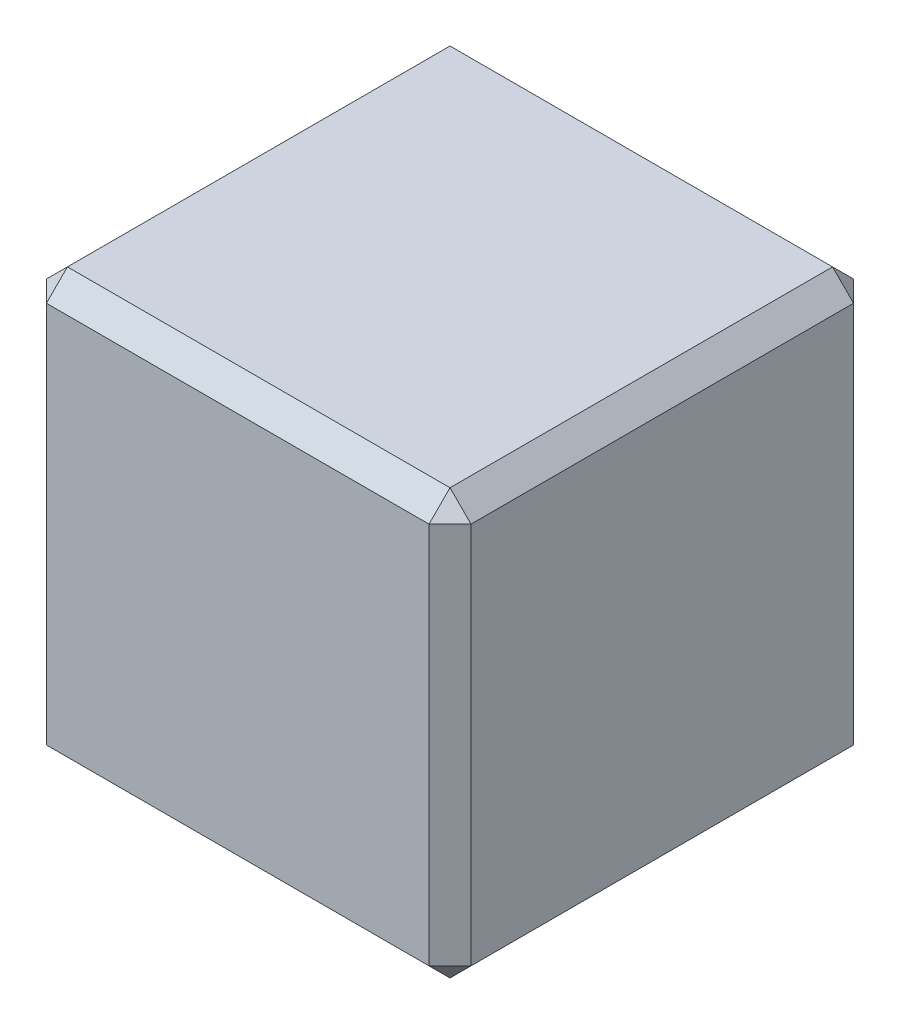
ISO-10303-21;
HEADER;
FILE_DESCRIPTION(('STEP AP214'),'2;1');
FILE_NAME('part.step','',(''),(''),'','','');
FILE_SCHEMA(('AUTOMOTIVE_DESIGN { 1 0 10303 214 1 1 1 1 }'));
ENDSEC;
DATA;
#1=APPLICATION_CONTEXT('core data for automotive mechanical design processes');
#2=APPLICATION_PROTOCOL_DEFINITION('international standard','automotive_design',2000,#1);
#3=PRODUCT_CONTEXT('',#1,'mechanical');
#4=PRODUCT('Part','Part','',(#3));
#5=PRODUCT_RELATED_PRODUCT_CATEGORY('part','',(#4));
#6=PRODUCT_DEFINITION_FORMATION('','',#4);
#7=PRODUCT_DEFINITION_CONTEXT('part definition',#1,'design');
#8=PRODUCT_DEFINITION('design','',#6,#7);
#9=PRODUCT_DEFINITION_SHAPE('','',#8);
#10=(LENGTH_UNIT() NAMED_UNIT(*) SI_UNIT(.MILLI.,.METRE.));
#11=(NAMED_UNIT(*) PLANE_ANGLE_UNIT() SI_UNIT($,.RADIAN.));
#12=(NAMED_UNIT(*) SI_UNIT($,.STERADIAN.) SOLID_ANGLE_UNIT());
#13=UNCERTAINTY_MEASURE_WITH_UNIT(LENGTH_MEASURE(1.E-05),#10,'distance_accuracy_value','');
#14=(GEOMETRIC_REPRESENTATION_CONTEXT(3) GLOBAL_UNCERTAINTY_ASSIGNED_CONTEXT((#13)) GLOBAL_UNIT_ASSIGNED_CONTEXT((#10,
#11,#12)) REPRESENTATION_CONTEXT('',''));
#15=CARTESIAN_POINT('',(0.,0.,0.));
#16=DIRECTION('',(0.,0.,1.));
#17=DIRECTION('',(1.,0.,0.));
#18=AXIS2_PLACEMENT_3D('',#15,#16,#17);
#19=CARTESIAN_POINT('',(50.54,101.08,-50.54));
#20=DIRECTION('',(-1.,0.,0.));
#21=DIRECTION('',(0.,0.,1.));
#22=AXIS2_PLACEMENT_3D('',#19,#20,#21);
#23=PLANE('',#22);
#24=DIRECTION('',(0.,0.,-1.));
#25=VECTOR('',#24,1.);
#26=CARTESIAN_POINT('',(50.54,5.00000000000002,-50.54));
#27=LINE('',#26,#25);
#28=CARTESIAN_POINT('',(50.54,5.00000000000002,45.54));
#29=VERTEX_POINT('',#28);
#30=CARTESIAN_POINT('',(50.54,5.00000000000002,-45.54));
#31=VERTEX_POINT('',#30);
#32=EDGE_CURVE('E286',#29,#31,#27,.T.);
#33=ORIENTED_EDGE('',*,*,#32,.T.);
#34=DIRECTION('',(0.,1.,0.));
#35=VECTOR('',#34,1.);
#36=CARTESIAN_POINT('',(50.54,101.08,-45.54));
#37=LINE('',#36,#35);
#38=CARTESIAN_POINT('',(50.54,96.08,-45.54));
#39=VERTEX_POINT('',#38);
#40=EDGE_CURVE('E218',#31,#39,#37,.T.);
#41=ORIENTED_EDGE('',*,*,#40,.T.);
#42=DIRECTION('',(0.,0.,1.));
#43=VECTOR('',#42,1.);
#44=CARTESIAN_POINT('',(50.54,96.08,50.54));
#45=LINE('',#44,#43);
#46=CARTESIAN_POINT('',(50.54,96.08,45.54));
#47=VERTEX_POINT('',#46);
#48=EDGE_CURVE('E279',#39,#47,#45,.T.);
#49=ORIENTED_EDGE('',*,*,#48,.T.);
#50=DIRECTION('',(0.,-1.,0.));
#51=VECTOR('',#50,1.);
#52=CARTESIAN_POINT('',(50.54,101.08,45.54));
#53=LINE('',#52,#51);
#54=EDGE_CURVE('E281',#47,#29,#53,.T.);
#55=ORIENTED_EDGE('',*,*,#54,.T.);
#56=EDGE_LOOP('',(#33,#41,#49,#55));
#57=FACE_BOUND('',#56,.T.);
#58=ADVANCED_FACE('F39',(#57),#23,.F.);
#59=CARTESIAN_POINT('',(-50.54,101.08,-50.54));
#60=DIRECTION('',(0.,0.,1.));
#61=DIRECTION('',(1.,0.,0.));
#62=AXIS2_PLACEMENT_3D('',#59,#60,#61);
#63=PLANE('',#62);
#64=DIRECTION('',(0.,-1.,0.));
#65=VECTOR('',#64,1.);
#66=CARTESIAN_POINT('',(45.54,101.08,-50.54));
#67=LINE('',#66,#65);
#68=CARTESIAN_POINT('',(45.54,96.08,-50.54));
#69=VERTEX_POINT('',#68);
#70=CARTESIAN_POINT('',(45.54,4.99999999999998,-50.54));
#71=VERTEX_POINT('',#70);
#72=EDGE_CURVE('E137',#69,#71,#67,.T.);
#73=ORIENTED_EDGE('',*,*,#72,.T.);
#74=DIRECTION('',(-1.,0.,0.));
#75=VECTOR('',#74,1.);
#76=CARTESIAN_POINT('',(-50.54,4.99999999999998,-50.54));
#77=LINE('',#76,#75);
#78=CARTESIAN_POINT('',(-45.54,4.99999999999998,-50.54));
#79=VERTEX_POINT('',#78);
#80=EDGE_CURVE('E133',#71,#79,#77,.T.);
#81=ORIENTED_EDGE('',*,*,#80,.T.);
#82=DIRECTION('',(0.,1.,0.));
#83=VECTOR('',#82,1.);
#84=CARTESIAN_POINT('',(-45.54,101.08,-50.54));
#85=LINE('',#84,#83);
#86=CARTESIAN_POINT('',(-45.54,96.08,-50.54));
#87=VERTEX_POINT('',#86);
#88=EDGE_CURVE('E127',#79,#87,#85,.T.);
#89=ORIENTED_EDGE('',*,*,#88,.T.);
#90=DIRECTION('',(1.,0.,0.));
#91=VECTOR('',#90,1.);
#92=CARTESIAN_POINT('',(50.54,96.08,-50.54));
#93=LINE('',#92,#91);
#94=EDGE_CURVE('E130',#87,#69,#93,.T.);
#95=ORIENTED_EDGE('',*,*,#94,.T.);
#96=EDGE_LOOP('',(#73,#81,#89,#95));
#97=FACE_BOUND('',#96,.T.);
#98=ADVANCED_FACE('F129',(#97),#63,.F.);
#99=CARTESIAN_POINT('',(-50.54,101.08,-50.54));
#100=DIRECTION('',(1.,0.,0.));
#101=DIRECTION('',(0.,0.,-1.));
#102=AXIS2_PLACEMENT_3D('',#99,#100,#101);
#103=PLANE('',#102);
#104=DIRECTION('',(0.,0.,-1.));
#105=VECTOR('',#104,1.);
#106=CARTESIAN_POINT('',(-50.54,96.08,-50.54));
#107=LINE('',#106,#105);
#108=CARTESIAN_POINT('',(-50.54,96.08,45.54));
#109=VERTEX_POINT('',#108);
#110=CARTESIAN_POINT('',(-50.54,96.08,-45.54));
#111=VERTEX_POINT('',#110);
#112=EDGE_CURVE('E228',#109,#111,#107,.T.);
#113=ORIENTED_EDGE('',*,*,#112,.T.);
#114=DIRECTION('',(0.,-1.,0.));
#115=VECTOR('',#114,1.);
#116=CARTESIAN_POINT('',(-50.54,101.08,-45.54));
#117=LINE('',#116,#115);
#118=CARTESIAN_POINT('',(-50.54,4.99999999999998,-45.54));
#119=VERTEX_POINT('',#118);
#120=EDGE_CURVE('E159',#111,#119,#117,.T.);
#121=ORIENTED_EDGE('',*,*,#120,.T.);
#122=DIRECTION('',(0.,0.,1.));
#123=VECTOR('',#122,1.);
#124=CARTESIAN_POINT('',(-50.54,4.99999999999998,-50.54));
#125=LINE('',#124,#123);
#126=CARTESIAN_POINT('',(-50.54,4.99999999999998,45.54));
#127=VERTEX_POINT('',#126);
#128=EDGE_CURVE('E236',#119,#127,#125,.T.);
#129=ORIENTED_EDGE('',*,*,#128,.T.);
#130=DIRECTION('',(0.,1.,0.));
#131=VECTOR('',#130,1.);
#132=CARTESIAN_POINT('',(-50.54,101.08,45.54));
#133=LINE('',#132,#131);
#134=EDGE_CURVE('E230',#127,#109,#133,.T.);
#135=ORIENTED_EDGE('',*,*,#134,.T.);
#136=EDGE_LOOP('',(#113,#121,#129,#135));
#137=FACE_BOUND('',#136,.T.);
#138=ADVANCED_FACE('F330',(#137),#103,.F.);
#139=CARTESIAN_POINT('',(-50.54,101.08,50.54));
#140=DIRECTION('',(0.,0.,-1.));
#141=DIRECTION('',(-1.,0.,0.));
#142=AXIS2_PLACEMENT_3D('',#139,#140,#141);
#143=PLANE('',#142);
#144=DIRECTION('',(1.,0.,0.));
#145=VECTOR('',#144,1.);
#146=CARTESIAN_POINT('',(-50.54,4.99999999999998,50.54));
#147=LINE('',#146,#145);
#148=CARTESIAN_POINT('',(-45.54,4.99999999999998,50.54));
#149=VERTEX_POINT('',#148);
#150=CARTESIAN_POINT('',(45.54,4.99999999999998,50.54));
#151=VERTEX_POINT('',#150);
#152=EDGE_CURVE('E224',#149,#151,#147,.T.);
#153=ORIENTED_EDGE('',*,*,#152,.T.);
#154=DIRECTION('',(0.,1.,0.));
#155=VECTOR('',#154,1.);
#156=CARTESIAN_POINT('',(45.54,101.08,50.54));
#157=LINE('',#156,#155);
#158=CARTESIAN_POINT('',(45.54,96.08,50.54));
#159=VERTEX_POINT('',#158);
#160=EDGE_CURVE('E221',#151,#159,#157,.T.);
#161=ORIENTED_EDGE('',*,*,#160,.T.);
#162=DIRECTION('',(-1.,0.,0.));
#163=VECTOR('',#162,1.);
#164=CARTESIAN_POINT('',(-50.54,96.08,50.54));
#165=LINE('',#164,#163);
#166=CARTESIAN_POINT('',(-45.54,96.08,50.54));
#167=VERTEX_POINT('',#166);
#168=EDGE_CURVE('E214',#159,#167,#165,.T.);
#169=ORIENTED_EDGE('',*,*,#168,.T.);
#170=DIRECTION('',(0.,-1.,0.));
#171=VECTOR('',#170,1.);
#172=CARTESIAN_POINT('',(-45.54,101.08,50.54));
#173=LINE('',#172,#171);
#174=EDGE_CURVE('E217',#167,#149,#173,.T.);
#175=ORIENTED_EDGE('',*,*,#174,.T.);
#176=EDGE_LOOP('',(#153,#161,#169,#175));
#177=FACE_BOUND('',#176,.T.);
#178=ADVANCED_FACE('F222',(#177),#143,.F.);
#179=CARTESIAN_POINT('',(0.,101.08,0.));
#180=DIRECTION('',(0.,1.,0.));
#181=DIRECTION('',(0.,0.,1.));
#182=AXIS2_PLACEMENT_3D('',#179,#180,#181);
#183=PLANE('',#182);
#184=DIRECTION('',(0.,0.,1.));
#185=VECTOR('',#184,1.);
#186=CARTESIAN_POINT('',(-45.54,101.08,50.54));
#187=LINE('',#186,#185);
#188=CARTESIAN_POINT('',(-45.54,101.08,-45.54));
#189=VERTEX_POINT('',#188);
#190=CARTESIAN_POINT('',(-45.54,101.08,45.54));
#191=VERTEX_POINT('',#190);
#192=EDGE_CURVE('E48',#189,#191,#187,.T.);
#193=ORIENTED_EDGE('',*,*,#192,.T.);
#194=DIRECTION('',(1.,0.,0.));
#195=VECTOR('',#194,1.);
#196=CARTESIAN_POINT('',(50.54,101.08,45.54));
#197=LINE('',#196,#195);
#198=CARTESIAN_POINT('',(45.54,101.08,45.54));
#199=VERTEX_POINT('',#198);
#200=EDGE_CURVE('E11',#191,#199,#197,.T.);
#201=ORIENTED_EDGE('',*,*,#200,.T.);
#202=DIRECTION('',(0.,0.,-1.));
#203=VECTOR('',#202,1.);
#204=CARTESIAN_POINT('',(45.54,101.08,-50.54));
#205=LINE('',#204,#203);
#206=CARTESIAN_POINT('',(45.54,101.08,-45.54));
#207=VERTEX_POINT('',#206);
#208=EDGE_CURVE('E239',#199,#207,#205,.T.);
#209=ORIENTED_EDGE('',*,*,#208,.T.);
#210=DIRECTION('',(-1.,0.,0.));
#211=VECTOR('',#210,1.);
#212=CARTESIAN_POINT('',(-50.54,101.08,-45.54));
#213=LINE('',#212,#211);
#214=EDGE_CURVE('E59',#207,#189,#213,.T.);
#215=ORIENTED_EDGE('',*,*,#214,.T.);
#216=EDGE_LOOP('',(#193,#201,#209,#215));
#217=FACE_BOUND('',#216,.T.);
#218=ADVANCED_FACE('F488',(#217),#183,.T.);
#219=CARTESIAN_POINT('',(0.,0.,0.));
#220=DIRECTION('',(0.,1.,0.));
#221=DIRECTION('',(0.,0.,1.));
#222=AXIS2_PLACEMENT_3D('',#219,#220,#221);
#223=PLANE('',#222);
#224=DIRECTION('',(0.,0.,-1.));
#225=VECTOR('',#224,1.);
#226=CARTESIAN_POINT('',(-45.54,0.,0.));
#227=LINE('',#226,#225);
#228=CARTESIAN_POINT('',(-45.54,0.,45.54));
#229=VERTEX_POINT('',#228);
#230=CARTESIAN_POINT('',(-45.54,0.,-45.54));
#231=VERTEX_POINT('',#230);
#232=EDGE_CURVE('E275',#229,#231,#227,.T.);
#233=ORIENTED_EDGE('',*,*,#232,.T.);
#234=DIRECTION('',(1.,0.,0.));
#235=VECTOR('',#234,1.);
#236=CARTESIAN_POINT('',(0.,0.,-45.54));
#237=LINE('',#236,#235);
#238=CARTESIAN_POINT('',(45.54,0.,-45.54));
#239=VERTEX_POINT('',#238);
#240=EDGE_CURVE('E269',#231,#239,#237,.T.);
#241=ORIENTED_EDGE('',*,*,#240,.T.);
#242=DIRECTION('',(0.,0.,1.));
#243=VECTOR('',#242,1.);
#244=CARTESIAN_POINT('',(45.54,0.,0.));
#245=LINE('',#244,#243);
#246=CARTESIAN_POINT('',(45.54,0.,45.54));
#247=VERTEX_POINT('',#246);
#248=EDGE_CURVE('E263',#239,#247,#245,.T.);
#249=ORIENTED_EDGE('',*,*,#248,.T.);
#250=DIRECTION('',(-1.,0.,0.));
#251=VECTOR('',#250,1.);
#252=CARTESIAN_POINT('',(0.,0.,45.54));
#253=LINE('',#252,#251);
#254=EDGE_CURVE('E270',#247,#229,#253,.T.);
#255=ORIENTED_EDGE('',*,*,#254,.T.);
#256=EDGE_LOOP('',(#233,#241,#249,#255));
#257=FACE_BOUND('',#256,.T.);
#258=ADVANCED_FACE('F273',(#257),#223,.F.);
#259=CARTESIAN_POINT('',(0.,101.08,45.54));
#260=DIRECTION('',(0.,0.707106781186545,0.70710678118655));
#261=DIRECTION('',(-1.,0.,0.));
#262=AXIS2_PLACEMENT_3D('',#259,#260,#261);
#263=PLANE('',#262);
#264=DIRECTION('',(0.,-0.70710678118655,0.707106781186545));
#265=VECTOR('',#264,1.);
#266=CARTESIAN_POINT('',(45.54,96.08,50.54));
#267=LINE('',#266,#265);
#268=EDGE_CURVE('E43',#199,#159,#267,.T.);
#269=ORIENTED_EDGE('',*,*,#268,.F.);
#270=ORIENTED_EDGE('',*,*,#200,.F.);
#271=DIRECTION('',(0.,0.70710678118655,-0.707106781186545));
#272=VECTOR('',#271,1.);
#273=CARTESIAN_POINT('',(-45.54,98.58,48.04));
#274=LINE('',#273,#272);
#275=EDGE_CURVE('E199',#167,#191,#274,.T.);
#276=ORIENTED_EDGE('',*,*,#275,.F.);
#277=ORIENTED_EDGE('',*,*,#168,.F.);
#278=EDGE_LOOP('',(#269,#270,#276,#277));
#279=FACE_BOUND('',#278,.T.);
#280=ADVANCED_FACE('F41',(#279),#263,.T.);
#281=CARTESIAN_POINT('',(45.54,96.08,50.54));
#282=DIRECTION('',(0.577350269189631,0.577350269189621,0.577350269189626));
#283=DIRECTION('',(0.707106781186545,0.,-0.70710678118655));
#284=AXIS2_PLACEMENT_3D('',#281,#282,#283);
#285=PLANE('',#284);
#286=DIRECTION('',(-0.707106781186544,0.70710678118655,0.));
#287=VECTOR('',#286,1.);
#288=CARTESIAN_POINT('',(48.04,98.58,45.54));
#289=LINE('',#288,#287);
#290=EDGE_CURVE('E195',#199,#47,#289,.F.);
#291=ORIENTED_EDGE('',*,*,#290,.F.);
#292=ORIENTED_EDGE('',*,*,#268,.T.);
#293=DIRECTION('',(-0.707106781186545,0.,0.70710678118655));
#294=VECTOR('',#293,1.);
#295=CARTESIAN_POINT('',(45.54,96.08,50.54));
#296=LINE('',#295,#294);
#297=EDGE_CURVE('E198',#47,#159,#296,.T.);
#298=ORIENTED_EDGE('',*,*,#297,.F.);
#299=EDGE_LOOP('',(#291,#292,#298));
#300=FACE_BOUND('',#299,.T.);
#301=ADVANCED_FACE('F211',(#300),#285,.T.);
#302=CARTESIAN_POINT('',(-50.54,96.08,45.54));
#303=DIRECTION('',(-0.577350269189631,0.577350269189621,0.577350269189626));
#304=DIRECTION('',(0.707106781186545,0.,0.70710678118655));
#305=AXIS2_PLACEMENT_3D('',#302,#303,#304);
#306=PLANE('',#305);
#307=DIRECTION('',(-0.707106781186545,0.,-0.70710678118655));
#308=VECTOR('',#307,1.);
#309=CARTESIAN_POINT('',(-50.54,96.08,45.54));
#310=LINE('',#309,#308);
#311=EDGE_CURVE('E189',#167,#109,#310,.T.);
#312=ORIENTED_EDGE('',*,*,#311,.F.);
#313=ORIENTED_EDGE('',*,*,#275,.T.);
#314=DIRECTION('',(-0.707106781186544,-0.70710678118655,0.));
#315=VECTOR('',#314,1.);
#316=CARTESIAN_POINT('',(-50.54,96.08,45.54));
#317=LINE('',#316,#315);
#318=EDGE_CURVE('E192',#109,#191,#317,.F.);
#319=ORIENTED_EDGE('',*,*,#318,.F.);
#320=EDGE_LOOP('',(#312,#313,#319));
#321=FACE_BOUND('',#320,.T.);
#322=ADVANCED_FACE('F461',(#321),#306,.T.);
#323=CARTESIAN_POINT('',(50.54,101.08,45.54));
#324=DIRECTION('',(-0.70710678118655,0.,-0.707106781186545));
#325=DIRECTION('',(0.,-1.,0.));
#326=AXIS2_PLACEMENT_3D('',#323,#324,#325);
#327=PLANE('',#326);
#328=ORIENTED_EDGE('',*,*,#297,.T.);
#329=ORIENTED_EDGE('',*,*,#160,.F.);
#330=DIRECTION('',(0.707106781186544,0.,-0.70710678118655));
#331=VECTOR('',#330,1.);
#332=CARTESIAN_POINT('',(48.04,5.,48.04));
#333=LINE('',#332,#331);
#334=EDGE_CURVE('E183',#29,#151,#333,.F.);
#335=ORIENTED_EDGE('',*,*,#334,.F.);
#336=ORIENTED_EDGE('',*,*,#54,.F.);
#337=EDGE_LOOP('',(#328,#329,#335,#336));
#338=FACE_BOUND('',#337,.T.);
#339=ADVANCED_FACE('F312',(#338),#327,.F.);
#340=CARTESIAN_POINT('',(45.54,101.08,0.));
#341=DIRECTION('',(0.70710678118655,0.707106781186545,0.));
#342=DIRECTION('',(0.,0.,1.));
#343=AXIS2_PLACEMENT_3D('',#340,#341,#342);
#344=PLANE('',#343);
#345=ORIENTED_EDGE('',*,*,#290,.T.);
#346=ORIENTED_EDGE('',*,*,#48,.F.);
#347=DIRECTION('',(0.707106781186544,-0.70710678118655,0.));
#348=VECTOR('',#347,1.);
#349=CARTESIAN_POINT('',(50.54,96.08,-45.54));
#350=LINE('',#349,#348);
#351=EDGE_CURVE('E180',#207,#39,#350,.T.);
#352=ORIENTED_EDGE('',*,*,#351,.F.);
#353=ORIENTED_EDGE('',*,*,#208,.F.);
#354=EDGE_LOOP('',(#345,#346,#352,#353));
#355=FACE_BOUND('',#354,.T.);
#356=ADVANCED_FACE('F445',(#355),#344,.T.);
#357=CARTESIAN_POINT('',(0.,101.08,-45.54));
#358=DIRECTION('',(0.,0.707106781186545,-0.70710678118655));
#359=DIRECTION('',(1.,0.,0.));
#360=AXIS2_PLACEMENT_3D('',#357,#358,#359);
#361=PLANE('',#360);
#362=DIRECTION('',(0.,-0.70710678118655,-0.707106781186545));
#363=VECTOR('',#362,1.);
#364=CARTESIAN_POINT('',(-45.54,96.08,-50.54));
#365=LINE('',#364,#363);
#366=EDGE_CURVE('E143',#189,#87,#365,.T.);
#367=ORIENTED_EDGE('',*,*,#366,.F.);
#368=ORIENTED_EDGE('',*,*,#214,.F.);
#369=DIRECTION('',(0.,0.707106781186551,0.707106781186545));
#370=VECTOR('',#369,1.);
#371=CARTESIAN_POINT('',(45.54,98.58,-48.04));
#372=LINE('',#371,#370);
#373=EDGE_CURVE('E146',#69,#207,#372,.T.);
#374=ORIENTED_EDGE('',*,*,#373,.F.);
#375=ORIENTED_EDGE('',*,*,#94,.F.);
#376=EDGE_LOOP('',(#367,#368,#374,#375));
#377=FACE_BOUND('',#376,.T.);
#378=ADVANCED_FACE('F142',(#377),#361,.T.);
#379=CARTESIAN_POINT('',(-45.54,101.08,0.));
#380=DIRECTION('',(-0.70710678118655,0.707106781186545,0.));
#381=DIRECTION('',(0.,0.,-1.));
#382=AXIS2_PLACEMENT_3D('',#379,#380,#381);
#383=PLANE('',#382);
#384=ORIENTED_EDGE('',*,*,#318,.T.);
#385=ORIENTED_EDGE('',*,*,#192,.F.);
#386=DIRECTION('',(0.707106781186545,0.70710678118655,0.));
#387=VECTOR('',#386,1.);
#388=CARTESIAN_POINT('',(-48.04,98.58,-45.54));
#389=LINE('',#388,#387);
#390=EDGE_CURVE('E155',#111,#189,#389,.T.);
#391=ORIENTED_EDGE('',*,*,#390,.F.);
#392=ORIENTED_EDGE('',*,*,#112,.F.);
#393=EDGE_LOOP('',(#384,#385,#391,#392));
#394=FACE_BOUND('',#393,.T.);
#395=ADVANCED_FACE('F429',(#394),#383,.T.);
#396=CARTESIAN_POINT('',(-45.54,101.08,50.54));
#397=DIRECTION('',(0.70710678118655,0.,-0.707106781186545));
#398=DIRECTION('',(0.,-1.,0.));
#399=AXIS2_PLACEMENT_3D('',#396,#397,#398);
#400=PLANE('',#399);
#401=ORIENTED_EDGE('',*,*,#311,.T.);
#402=ORIENTED_EDGE('',*,*,#134,.F.);
#403=DIRECTION('',(0.707106781186545,0.,0.70710678118655));
#404=VECTOR('',#403,1.);
#405=CARTESIAN_POINT('',(-48.04,4.99999999999998,48.04));
#406=LINE('',#405,#404);
#407=EDGE_CURVE('E175',#149,#127,#406,.F.);
#408=ORIENTED_EDGE('',*,*,#407,.F.);
#409=ORIENTED_EDGE('',*,*,#174,.F.);
#410=EDGE_LOOP('',(#401,#402,#408,#409));
#411=FACE_BOUND('',#410,.T.);
#412=ADVANCED_FACE('F297',(#411),#400,.F.);
#413=CARTESIAN_POINT('',(-50.54,4.99999999999998,50.54));
#414=DIRECTION('',(0.,0.70710678118655,-0.707106781186545));
#415=DIRECTION('',(1.,0.,0.));
#416=AXIS2_PLACEMENT_3D('',#413,#414,#415);
#417=PLANE('',#416);
#418=DIRECTION('',(0.,0.707106781186545,0.70710678118655));
#419=VECTOR('',#418,1.);
#420=CARTESIAN_POINT('',(45.54,0.,45.54));
#421=LINE('',#420,#419);
#422=EDGE_CURVE('E186',#151,#247,#421,.F.);
#423=ORIENTED_EDGE('',*,*,#422,.F.);
#424=ORIENTED_EDGE('',*,*,#152,.F.);
#425=DIRECTION('',(0.,-0.707106781186544,-0.70710678118655));
#426=VECTOR('',#425,1.);
#427=CARTESIAN_POINT('',(-45.54,0.,45.54));
#428=LINE('',#427,#426);
#429=EDGE_CURVE('E172',#229,#149,#428,.F.);
#430=ORIENTED_EDGE('',*,*,#429,.F.);
#431=ORIENTED_EDGE('',*,*,#254,.F.);
#432=EDGE_LOOP('',(#423,#424,#430,#431));
#433=FACE_BOUND('',#432,.T.);
#434=ADVANCED_FACE('F294',(#433),#417,.F.);
#435=CARTESIAN_POINT('',(45.54,0.,45.54));
#436=DIRECTION('',(0.577350269189631,-0.577350269189626,0.577350269189621));
#437=DIRECTION('',(0.707106781186545,0.70710678118655,0.));
#438=AXIS2_PLACEMENT_3D('',#435,#436,#437);
#439=PLANE('',#438);
#440=ORIENTED_EDGE('',*,*,#334,.T.);
#441=ORIENTED_EDGE('',*,*,#422,.T.);
#442=DIRECTION('',(-0.707106781186545,-0.70710678118655,0.));
#443=VECTOR('',#442,1.);
#444=CARTESIAN_POINT('',(45.54,0.,45.54));
#445=LINE('',#444,#443);
#446=EDGE_CURVE('E163',#29,#247,#445,.T.);
#447=ORIENTED_EDGE('',*,*,#446,.F.);
#448=EDGE_LOOP('',(#440,#441,#447));
#449=FACE_BOUND('',#448,.T.);
#450=ADVANCED_FACE('F314',(#449),#439,.T.);
#451=CARTESIAN_POINT('',(50.54,96.08,-45.54));
#452=DIRECTION('',(0.577350269189631,0.577350269189621,-0.577350269189626));
#453=DIRECTION('',(-0.707106781186545,0.,-0.70710678118655));
#454=AXIS2_PLACEMENT_3D('',#451,#452,#453);
#455=PLANE('',#454);
#456=ORIENTED_EDGE('',*,*,#373,.T.);
#457=ORIENTED_EDGE('',*,*,#351,.T.);
#458=DIRECTION('',(0.707106781186545,0.,0.70710678118655));
#459=VECTOR('',#458,1.);
#460=CARTESIAN_POINT('',(50.54,96.08,-45.54));
#461=LINE('',#460,#459);
#462=EDGE_CURVE('E160',#69,#39,#461,.T.);
#463=ORIENTED_EDGE('',*,*,#462,.F.);
#464=EDGE_LOOP('',(#456,#457,#463));
#465=FACE_BOUND('',#464,.T.);
#466=ADVANCED_FACE('F316',(#465),#455,.T.);
#467=CARTESIAN_POINT('',(-45.54,96.08,-50.54));
#468=DIRECTION('',(-0.577350269189626,0.577350269189621,-0.577350269189631));
#469=DIRECTION('',(-0.70710678118655,0.,0.707106781186545));
#470=AXIS2_PLACEMENT_3D('',#467,#468,#469);
#471=PLANE('',#470);
#472=ORIENTED_EDGE('',*,*,#390,.T.);
#473=ORIENTED_EDGE('',*,*,#366,.T.);
#474=DIRECTION('',(0.70710678118655,0.,-0.707106781186545));
#475=VECTOR('',#474,1.);
#476=CARTESIAN_POINT('',(-45.54,96.08,-50.54));
#477=LINE('',#476,#475);
#478=EDGE_CURVE('E152',#111,#87,#477,.T.);
#479=ORIENTED_EDGE('',*,*,#478,.F.);
#480=EDGE_LOOP('',(#472,#473,#479));
#481=FACE_BOUND('',#480,.T.);
#482=ADVANCED_FACE('F151',(#481),#471,.T.);
#483=CARTESIAN_POINT('',(-45.54,0.,45.54));
#484=DIRECTION('',(-0.577350269189626,-0.577350269189631,0.577350269189621));
#485=DIRECTION('',(0.70710678118655,-0.707106781186545,0.));
#486=AXIS2_PLACEMENT_3D('',#483,#484,#485);
#487=PLANE('',#486);
#488=ORIENTED_EDGE('',*,*,#429,.T.);
#489=ORIENTED_EDGE('',*,*,#407,.T.);
#490=DIRECTION('',(-0.70710678118655,0.707106781186545,0.));
#491=VECTOR('',#490,1.);
#492=CARTESIAN_POINT('',(-45.54,0.,45.54));
#493=LINE('',#492,#491);
#494=EDGE_CURVE('E161',#229,#127,#493,.T.);
#495=ORIENTED_EDGE('',*,*,#494,.F.);
#496=EDGE_LOOP('',(#488,#489,#495));
#497=FACE_BOUND('',#496,.T.);
#498=ADVANCED_FACE('F299',(#497),#487,.T.);
#499=CARTESIAN_POINT('',(50.54,5.00000000000002,-50.54));
#500=DIRECTION('',(-0.70710678118655,0.707106781186545,0.));
#501=DIRECTION('',(0.,0.,-1.));
#502=AXIS2_PLACEMENT_3D('',#499,#500,#501);
#503=PLANE('',#502);
#504=ORIENTED_EDGE('',*,*,#446,.T.);
#505=ORIENTED_EDGE('',*,*,#248,.F.);
#506=DIRECTION('',(0.707106781186545,0.70710678118655,0.));
#507=VECTOR('',#506,1.);
#508=CARTESIAN_POINT('',(45.54,0.,-45.54));
#509=LINE('',#508,#507);
#510=EDGE_CURVE('E166',#31,#239,#509,.F.);
#511=ORIENTED_EDGE('',*,*,#510,.F.);
#512=ORIENTED_EDGE('',*,*,#32,.F.);
#513=EDGE_LOOP('',(#504,#505,#511,#512));
#514=FACE_BOUND('',#513,.T.);
#515=ADVANCED_FACE('F265',(#514),#503,.F.);
#516=CARTESIAN_POINT('',(45.54,101.08,-50.54));
#517=DIRECTION('',(-0.70710678118655,0.,0.707106781186545));
#518=DIRECTION('',(0.,-1.,0.));
#519=AXIS2_PLACEMENT_3D('',#516,#517,#518);
#520=PLANE('',#519);
#521=ORIENTED_EDGE('',*,*,#462,.T.);
#522=ORIENTED_EDGE('',*,*,#40,.F.);
#523=DIRECTION('',(-0.707106781186544,0.,-0.70710678118655));
#524=VECTOR('',#523,1.);
#525=CARTESIAN_POINT('',(48.04,5.,-48.04));
#526=LINE('',#525,#524);
#527=EDGE_CURVE('E252',#71,#31,#526,.F.);
#528=ORIENTED_EDGE('',*,*,#527,.F.);
#529=ORIENTED_EDGE('',*,*,#72,.F.);
#530=EDGE_LOOP('',(#521,#522,#528,#529));
#531=FACE_BOUND('',#530,.T.);
#532=ADVANCED_FACE('F309',(#531),#520,.F.);
#533=CARTESIAN_POINT('',(-50.54,101.08,-45.54));
#534=DIRECTION('',(0.707106781186545,0.,0.70710678118655));
#535=DIRECTION('',(0.,-1.,0.));
#536=AXIS2_PLACEMENT_3D('',#533,#534,#535);
#537=PLANE('',#536);
#538=ORIENTED_EDGE('',*,*,#478,.T.);
#539=ORIENTED_EDGE('',*,*,#88,.F.);
#540=DIRECTION('',(-0.70710678118655,0.,0.707106781186545));
#541=VECTOR('',#540,1.);
#542=CARTESIAN_POINT('',(-45.54,4.99999999999998,-50.54));
#543=LINE('',#542,#541);
#544=EDGE_CURVE('E249',#119,#79,#543,.F.);
#545=ORIENTED_EDGE('',*,*,#544,.F.);
#546=ORIENTED_EDGE('',*,*,#120,.F.);
#547=EDGE_LOOP('',(#538,#539,#545,#546));
#548=FACE_BOUND('',#547,.T.);
#549=ADVANCED_FACE('F157',(#548),#537,.F.);
#550=CARTESIAN_POINT('',(-50.54,4.99999999999998,-50.54));
#551=DIRECTION('',(0.707106781186545,0.70710678118655,0.));
#552=DIRECTION('',(0.,0.,1.));
#553=AXIS2_PLACEMENT_3D('',#550,#551,#552);
#554=PLANE('',#553);
#555=ORIENTED_EDGE('',*,*,#494,.T.);
#556=ORIENTED_EDGE('',*,*,#128,.F.);
#557=DIRECTION('',(0.70710678118655,-0.707106781186544,0.));
#558=VECTOR('',#557,1.);
#559=CARTESIAN_POINT('',(-48.04,2.49999999999999,-45.54));
#560=LINE('',#559,#558);
#561=EDGE_CURVE('E247',#231,#119,#560,.F.);
#562=ORIENTED_EDGE('',*,*,#561,.F.);
#563=ORIENTED_EDGE('',*,*,#232,.F.);
#564=EDGE_LOOP('',(#555,#556,#562,#563));
#565=FACE_BOUND('',#564,.T.);
#566=ADVANCED_FACE('F302',(#565),#554,.F.);
#567=CARTESIAN_POINT('',(45.54,0.,-45.54));
#568=DIRECTION('',(0.577350269189631,-0.577350269189626,-0.577350269189621));
#569=DIRECTION('',(0.707106781186545,0.70710678118655,0.));
#570=AXIS2_PLACEMENT_3D('',#567,#568,#569);
#571=PLANE('',#570);
#572=ORIENTED_EDGE('',*,*,#527,.T.);
#573=ORIENTED_EDGE('',*,*,#510,.T.);
#574=DIRECTION('',(0.,-0.707106781186545,0.707106781186551));
#575=VECTOR('',#574,1.);
#576=CARTESIAN_POINT('',(45.54,0.,-45.54));
#577=LINE('',#576,#575);
#578=EDGE_CURVE('E245',#71,#239,#577,.T.);
#579=ORIENTED_EDGE('',*,*,#578,.F.);
#580=EDGE_LOOP('',(#572,#573,#579));
#581=FACE_BOUND('',#580,.T.);
#582=ADVANCED_FACE('F259',(#581),#571,.T.);
#583=CARTESIAN_POINT('',(-45.54,4.99999999999998,-50.54));
#584=DIRECTION('',(-0.577350269189621,-0.577350269189631,-0.577350269189626));
#585=DIRECTION('',(0.,0.707106781186545,-0.70710678118655));
#586=AXIS2_PLACEMENT_3D('',#583,#584,#585);
#587=PLANE('',#586);
#588=ORIENTED_EDGE('',*,*,#561,.T.);
#589=ORIENTED_EDGE('',*,*,#544,.T.);
#590=DIRECTION('',(0.,0.707106781186545,-0.70710678118655));
#591=VECTOR('',#590,1.);
#592=CARTESIAN_POINT('',(-45.54,4.99999999999998,-50.54));
#593=LINE('',#592,#591);
#594=EDGE_CURVE('E243',#231,#79,#593,.T.);
#595=ORIENTED_EDGE('',*,*,#594,.F.);
#596=EDGE_LOOP('',(#588,#589,#595));
#597=FACE_BOUND('',#596,.T.);
#598=ADVANCED_FACE('F337',(#597),#587,.T.);
#599=CARTESIAN_POINT('',(-50.54,4.99999999999998,-50.54));
#600=DIRECTION('',(0.,0.70710678118655,0.707106781186545));
#601=DIRECTION('',(-1.,0.,0.));
#602=AXIS2_PLACEMENT_3D('',#599,#600,#601);
#603=PLANE('',#602);
#604=ORIENTED_EDGE('',*,*,#578,.T.);
#605=ORIENTED_EDGE('',*,*,#240,.F.);
#606=ORIENTED_EDGE('',*,*,#594,.T.);
#607=ORIENTED_EDGE('',*,*,#80,.F.);
#608=EDGE_LOOP('',(#604,#605,#606,#607));
#609=FACE_BOUND('',#608,.T.);
#610=ADVANCED_FACE('F334',(#609),#603,.F.);
#611=CLOSED_SHELL('',(#58,#98,#138,#178,#218,#258,#280,#301,#322,#339,#356,#378,#395,#412,#434,
#450,#466,#482,#498,#515,#532,#549,#566,#582,#598,#610));
#612=MANIFOLD_SOLID_BREP('B2',#611);
#613=ADVANCED_BREP_SHAPE_REPRESENTATION('',(#18,#612),#14);
#614=SHAPE_DEFINITION_REPRESENTATION(#9,#613);
ENDSEC;
END-ISO-10303-21;
